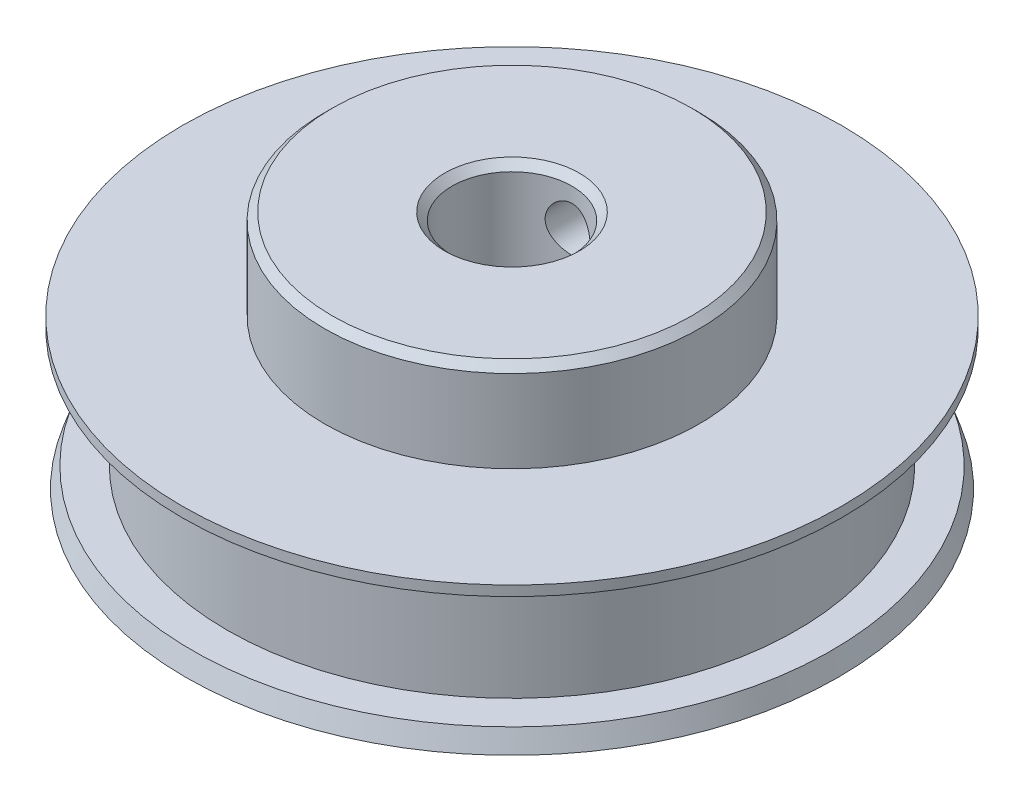
ISO-10303-21;
HEADER;
FILE_DESCRIPTION(('STEP AP214'),'2;1');
FILE_NAME('part.step','',(''),(''),'','','');
FILE_SCHEMA(('AUTOMOTIVE_DESIGN { 1 0 10303 214 1 1 1 1 }'));
ENDSEC;
DATA;
#1=APPLICATION_CONTEXT('core data for automotive mechanical design processes');
#2=APPLICATION_PROTOCOL_DEFINITION('international standard','automotive_design',2000,#1);
#3=PRODUCT_CONTEXT('',#1,'mechanical');
#4=PRODUCT('Part','Part','',(#3));
#5=PRODUCT_RELATED_PRODUCT_CATEGORY('part','',(#4));
#6=PRODUCT_DEFINITION_FORMATION('','',#4);
#7=PRODUCT_DEFINITION_CONTEXT('part definition',#1,'design');
#8=PRODUCT_DEFINITION('design','',#6,#7);
#9=PRODUCT_DEFINITION_SHAPE('','',#8);
#10=(LENGTH_UNIT() NAMED_UNIT(*) SI_UNIT(.MILLI.,.METRE.));
#11=(NAMED_UNIT(*) PLANE_ANGLE_UNIT() SI_UNIT($,.RADIAN.));
#12=(NAMED_UNIT(*) SI_UNIT($,.STERADIAN.) SOLID_ANGLE_UNIT());
#13=UNCERTAINTY_MEASURE_WITH_UNIT(LENGTH_MEASURE(1.E-05),#10,'distance_accuracy_value','');
#14=(GEOMETRIC_REPRESENTATION_CONTEXT(3) GLOBAL_UNCERTAINTY_ASSIGNED_CONTEXT((#13)) GLOBAL_UNIT_ASSIGNED_CONTEXT((#10,
#11,#12)) REPRESENTATION_CONTEXT('',''));
#15=CARTESIAN_POINT('',(0.,0.,0.));
#16=DIRECTION('',(0.,0.,1.));
#17=DIRECTION('',(1.,0.,0.));
#18=AXIS2_PLACEMENT_3D('',#15,#16,#17);
#19=CARTESIAN_POINT('',(0.,10.,0.));
#20=DIRECTION('',(0.,-1.,0.));
#21=DIRECTION('',(0.,0.,-1.));
#22=AXIS2_PLACEMENT_3D('',#19,#20,#21);
#23=CYLINDRICAL_SURFACE('',#22,22.);
#24=CARTESIAN_POINT('',(0.,9.32933000000001,0.));
#25=DIRECTION('',(0.,-1.,0.));
#26=DIRECTION('',(0.,0.,-1.));
#27=AXIS2_PLACEMENT_3D('',#24,#25,#26);
#28=CIRCLE('',#27,22.);
#29=CARTESIAN_POINT('',(0.,9.32933000000001,-22.));
#30=VERTEX_POINT('',#29);
#31=EDGE_CURVE('E71',#30,#30,#28,.F.);
#32=ORIENTED_EDGE('',*,*,#31,.T.);
#33=EDGE_LOOP('',(#32));
#34=FACE_BOUND('',#33,.T.);
#35=CARTESIAN_POINT('',(0.,10.,0.));
#36=DIRECTION('',(0.,1.,0.));
#37=DIRECTION('',(0.,0.,1.));
#38=AXIS2_PLACEMENT_3D('',#35,#36,#37);
#39=CIRCLE('',#38,22.);
#40=CARTESIAN_POINT('',(0.,10.,22.));
#41=VERTEX_POINT('',#40);
#42=EDGE_CURVE('E88',#41,#41,#39,.T.);
#43=ORIENTED_EDGE('',*,*,#42,.F.);
#44=EDGE_LOOP('',(#43));
#45=FACE_BOUND('',#44,.T.);
#46=ADVANCED_FACE('F38',(#34,#45),#23,.T.);
#47=CARTESIAN_POINT('',(0.,10.,0.));
#48=DIRECTION('',(0.,1.,0.));
#49=DIRECTION('',(0.,0.,1.));
#50=AXIS2_PLACEMENT_3D('',#47,#48,#49);
#51=PLANE('',#50);
#52=CARTESIAN_POINT('',(0.,10.,0.));
#53=DIRECTION('',(0.,1.,0.));
#54=DIRECTION('',(0.,0.,1.));
#55=AXIS2_PLACEMENT_3D('',#52,#53,#54);
#56=CIRCLE('',#55,12.5);
#57=CARTESIAN_POINT('',(0.,10.,12.5));
#58=VERTEX_POINT('',#57);
#59=EDGE_CURVE('E87',#58,#58,#56,.T.);
#60=ORIENTED_EDGE('',*,*,#59,.F.);
#61=EDGE_LOOP('',(#60));
#62=FACE_BOUND('',#61,.T.);
#63=ORIENTED_EDGE('',*,*,#42,.T.);
#64=EDGE_LOOP('',(#63));
#65=FACE_BOUND('',#64,.T.);
#66=ADVANCED_FACE('F143',(#62,#65),#51,.T.);
#67=CARTESIAN_POINT('',(0.,0.,0.));
#68=DIRECTION('',(0.,1.,0.));
#69=DIRECTION('',(0.,0.,1.));
#70=AXIS2_PLACEMENT_3D('',#67,#68,#69);
#71=PLANE('',#70);
#72=CARTESIAN_POINT('',(0.,0.,0.));
#73=DIRECTION('',(0.,1.,0.));
#74=DIRECTION('',(0.,0.,1.));
#75=AXIS2_PLACEMENT_3D('',#72,#73,#74);
#76=CIRCLE('',#75,4.50000000000001);
#77=CARTESIAN_POINT('',(0.,0.,4.50000000000001));
#78=VERTEX_POINT('',#77);
#79=EDGE_CURVE('E57',#78,#78,#76,.T.);
#80=ORIENTED_EDGE('',*,*,#79,.T.);
#81=EDGE_LOOP('',(#80));
#82=FACE_BOUND('',#81,.T.);
#83=CARTESIAN_POINT('',(0.,0.,0.));
#84=DIRECTION('',(0.,1.,0.));
#85=DIRECTION('',(0.,0.,1.));
#86=AXIS2_PLACEMENT_3D('',#83,#84,#85);
#87=CIRCLE('',#86,21.77689);
#88=CARTESIAN_POINT('',(0.,0.,21.77689));
#89=VERTEX_POINT('',#88);
#90=EDGE_CURVE('E83',#89,#89,#87,.F.);
#91=ORIENTED_EDGE('',*,*,#90,.T.);
#92=EDGE_LOOP('',(#91));
#93=FACE_BOUND('',#92,.T.);
#94=ADVANCED_FACE('F149',(#82,#93),#71,.F.);
#95=CARTESIAN_POINT('',(0.,16.,0.));
#96=DIRECTION('',(0.,-1.,0.));
#97=DIRECTION('',(0.,0.,-1.));
#98=AXIS2_PLACEMENT_3D('',#95,#96,#97);
#99=CYLINDRICAL_SURFACE('',#98,12.5);
#100=CARTESIAN_POINT('',(0.,15.5,0.));
#101=DIRECTION('',(0.,1.,0.));
#102=DIRECTION('',(0.,0.,1.));
#103=AXIS2_PLACEMENT_3D('',#100,#101,#102);
#104=CIRCLE('',#103,12.5);
#105=CARTESIAN_POINT('',(0.,15.5,12.5));
#106=VERTEX_POINT('',#105);
#107=EDGE_CURVE('E10',#106,#106,#104,.F.);
#108=ORIENTED_EDGE('',*,*,#107,.T.);
#109=EDGE_LOOP('',(#108));
#110=FACE_BOUND('',#109,.T.);
#111=CARTESIAN_POINT('',(1.5,13.,-12.4096736459909));
#112=CARTESIAN_POINT('',(1.49999641586388,12.9160704294048,-12.4096748089167));
#113=CARTESIAN_POINT('',(1.49293206748169,12.8320877399393,-12.4105342894214));
#114=CARTESIAN_POINT('',(1.46486159354819,12.6664576939842,-12.4138782255216));
#115=CARTESIAN_POINT('',(1.44384072619508,12.5848129021595,-12.4163643992983));
#116=CARTESIAN_POINT('',(1.38848417307918,12.4262807972431,-12.4226761552619));
#117=CARTESIAN_POINT('',(1.35415731394874,12.3493903694319,-12.426500849368));
#118=CARTESIAN_POINT('',(1.27318168778971,12.2024764289495,-12.4350576249844));
#119=CARTESIAN_POINT('',(1.22653510106007,12.132451704216,-12.4397895458966));
#120=CARTESIAN_POINT('',(1.1219857196502,12.0008801141949,-12.4496550027324));
#121=CARTESIAN_POINT('',(1.06403198625323,11.9393738528257,-12.4547902908254));
#122=CARTESIAN_POINT('',(0.938622932174396,11.826935640919,-12.4648680792729));
#123=CARTESIAN_POINT('',(0.87116714752707,11.7760042070291,-12.4698105701984));
#124=CARTESIAN_POINT('',(0.72841478423399,11.6860167335319,-12.4789637011531));
#125=CARTESIAN_POINT('',(0.653094976924496,11.6469972921302,-12.4831720690333));
#126=CARTESIAN_POINT('',(0.49691288363639,11.5821757698076,-12.4903635621621));
#127=CARTESIAN_POINT('',(0.416050788042772,11.5563732351261,-12.4933467294733));
#128=CARTESIAN_POINT('',(0.251493928492542,11.5188388719483,-12.4977393662263));
#129=CARTESIAN_POINT('',(0.16781473552169,11.5070396732771,-12.4991563682204));
#130=CARTESIAN_POINT('',(-0.000347248334281743,11.4976382003447,-12.5002827183051));
#131=CARTESIAN_POINT('',(-0.0848300098341689,11.5000354089209,-12.4999921286017));
#132=CARTESIAN_POINT('',(-0.251742833758764,11.5189045609257,-12.4977421462633));
#133=CARTESIAN_POINT('',(-0.334181218784105,11.5353040524862,-12.4957913442169));
#134=CARTESIAN_POINT('',(-0.495127185045587,11.581599075858,-12.490449821119));
#135=CARTESIAN_POINT('',(-0.573634696521301,11.6114948470908,-12.4870590745233));
#136=CARTESIAN_POINT('',(-0.724715561629687,11.6840113644533,-12.4792038952277));
#137=CARTESIAN_POINT('',(-0.797273648637691,11.7266636180032,-12.4747368094346));
#138=CARTESIAN_POINT('',(-0.934229460099391,11.8234594494781,-12.465229048358));
#139=CARTESIAN_POINT('',(-0.998626839383444,11.8776035132078,-12.4601883488298));
#140=CARTESIAN_POINT('',(-1.11785860561525,11.9962521747702,-12.4500603372648));
#141=CARTESIAN_POINT('',(-1.17263019439189,12.0608198906867,-12.4449729316271));
#142=CARTESIAN_POINT('',(-1.27056795912578,12.1982657568398,-12.4353563023037));
#143=CARTESIAN_POINT('',(-1.31373410365263,12.2711439295822,-12.4308270801297));
#144=CARTESIAN_POINT('',(-1.38723839179325,12.4231962450737,-12.4228396027608));
#145=CARTESIAN_POINT('',(-1.41757175578821,12.502372720629,-12.4193817467283));
#146=CARTESIAN_POINT('',(-1.46449505016189,12.6647461797506,-12.4139364153306));
#147=CARTESIAN_POINT('',(-1.48108558929275,12.7479429850596,-12.4119488748366));
#148=CARTESIAN_POINT('',(-1.49996964356083,12.9154415481883,-12.4096810007818));
#149=CARTESIAN_POINT('',(-1.50235142135386,12.9997332179406,-12.4093901280317));
#150=CARTESIAN_POINT('',(-1.49298299027801,13.1675143904215,-12.4105206650573));
#151=CARTESIAN_POINT('',(-1.48123305845624,13.2510039088437,-12.411942041265));
#152=CARTESIAN_POINT('',(-1.44400895971009,13.414547891799,-12.4163273137489));
#153=CARTESIAN_POINT('',(-1.41857731249469,13.4946121734047,-12.4192864301079));
#154=CARTESIAN_POINT('',(-1.35475538396312,13.649339641488,-12.4264098926624));
#155=CARTESIAN_POINT('',(-1.31636468129306,13.7240026522515,-12.4305742780457));
#156=CARTESIAN_POINT('',(-1.22749651360805,13.8662081474873,-12.4396643656649));
#157=CARTESIAN_POINT('',(-1.17696103570738,13.9337141434407,-12.4445936804928));
#158=CARTESIAN_POINT('',(-1.06532008918354,14.0593175565059,-12.4546467770184));
#159=CARTESIAN_POINT('',(-1.0042142422181,14.1174146367029,-12.4597705656719));
#160=CARTESIAN_POINT('',(-0.872782136333861,14.2228598736175,-12.4696675472455));
#161=CARTESIAN_POINT('',(-0.802409249708916,14.2701501232557,-12.4744387628015));
#162=CARTESIAN_POINT('',(-0.654668214705289,14.3522391046645,-12.483063621558));
#163=CARTESIAN_POINT('',(-0.577300197822208,14.3870380711872,-12.4869172820019));
#164=CARTESIAN_POINT('',(-0.417959622359993,14.4430605024379,-12.4932640215257));
#165=CARTESIAN_POINT('',(-0.335999085323591,14.4643177599421,-12.4957604851314));
#166=CARTESIAN_POINT('',(-0.16964029249574,14.4927633717911,-12.4991255682254));
#167=CARTESIAN_POINT('',(-0.0852421377306314,14.4999523083466,-12.4999942550783));
#168=CARTESIAN_POINT('',(0.0830300031278284,14.5000469220562,-12.5000056524324));
#169=CARTESIAN_POINT('',(0.166903952329434,14.4930420183416,-12.4991591682624));
#170=CARTESIAN_POINT('',(0.332273612398116,14.4651367725488,-12.4958567701035));
#171=CARTESIAN_POINT('',(0.413769324044742,14.4442364350252,-12.4934008566421));
#172=CARTESIAN_POINT('',(0.572059777991806,14.3891609924342,-12.4871544009745));
#173=CARTESIAN_POINT('',(0.648855904373997,14.3549898177728,-12.4833642539575));
#174=CARTESIAN_POINT('',(0.795637705262653,14.2743519652078,-12.474869622158));
#175=CARTESIAN_POINT('',(0.865623324646849,14.2278851877986,-12.4701651299761));
#176=CARTESIAN_POINT('',(0.997254742124291,14.1236431589969,-12.4603319681132));
#177=CARTESIAN_POINT('',(1.0588476339384,14.0658013223371,-12.4552009088046));
#178=CARTESIAN_POINT('',(1.17148865356204,13.9405884814238,-12.4451123432295));
#179=CARTESIAN_POINT('',(1.22253427406543,13.8732152177493,-12.4401548784622));
#180=CARTESIAN_POINT('',(1.31278537364373,13.7305785319148,-12.4309559603764));
#181=CARTESIAN_POINT('',(1.35194799100155,13.6552878358635,-12.4267171228205));
#182=CARTESIAN_POINT('',(1.41701902911872,13.4991911231246,-12.419466118837));
#183=CARTESIAN_POINT('',(1.44294198213015,13.4183912644011,-12.4164526081981));
#184=CARTESIAN_POINT('',(1.4745350503682,13.2809702304473,-12.4127313618494));
#185=CARTESIAN_POINT('',(1.48407082470974,13.2252186240201,-12.4115903654975));
#186=CARTESIAN_POINT('',(1.49680448454755,13.1129860339329,-12.4100611186528));
#187=CARTESIAN_POINT('',(1.50000241299709,13.0565050552187,-12.4096728630583));
#188=CARTESIAN_POINT('',(1.5,13.,-12.4096736459909));
#189=B_SPLINE_CURVE_WITH_KNOTS('',3,(#111,#112,#113,#114,#115,#116,#117,#118,#119,#120,#121,
#122,#123,#124,#125,#126,#127,#128,#129,#130,#131,#132,#133,#134,#135,#136,#137,#138,#139,#140,
#141,#142,#143,#144,#145,#146,#147,#148,#149,#150,#151,#152,#153,#154,#155,#156,#157,#158,#159,
#160,#161,#162,#163,#164,#165,#166,#167,#168,#169,#170,#171,#172,#173,#174,#175,#176,#177,#178,
#179,#180,#181,#182,#183,#184,#185,#186,#187,#188),.UNSPECIFIED.,.T.,.F.,(4,2,2,2,2,2,2,2,2,2,2,
2,2,2,2,2,2,2,2,2,2,2,2,2,2,2,2,2,2,2,2,2,2,2,2,2,2,2,4),(0.,0.25158230660961,0.503430774819311,
0.755112462522261,1.0067496383611,1.25954776660377,1.5123582427361,1.76593780876769,
2.01950866836447,2.27185458608052,2.52419131111312,2.77523023079344,3.02627360403335,
3.27794222677635,3.52962149067918,3.78288622204422,4.03615163930559,4.28951130338294,
4.54285974404081,4.79463277043148,5.0464008609825,5.29739099483104,5.54838929022027,
5.80061125155308,6.05284224246467,6.30639464647639,6.55994228515918,6.81285470170487,
7.06575665136928,7.31707030939075,7.56838388503437,7.81962308616497,8.07086432058376,
8.32362252061905,8.57644073759112,8.83016031080822,9.08360079205962,9.25297814464871,
9.42235434931908),.UNSPECIFIED.);
#190=CARTESIAN_POINT('',(1.5,13.,-12.4096736459909));
#191=VERTEX_POINT('',#190);
#192=EDGE_CURVE('E92',#191,#191,#189,.T.);
#193=ORIENTED_EDGE('',*,*,#192,.F.);
#194=EDGE_LOOP('',(#193));
#195=FACE_BOUND('',#194,.T.);
#196=ORIENTED_EDGE('',*,*,#59,.T.);
#197=EDGE_LOOP('',(#196));
#198=FACE_BOUND('',#197,.T.);
#199=ADVANCED_FACE('F203',(#110,#195,#198),#99,.T.);
#200=CARTESIAN_POINT('',(0.,16.,0.));
#201=DIRECTION('',(0.,1.,0.));
#202=DIRECTION('',(0.,0.,1.));
#203=AXIS2_PLACEMENT_3D('',#200,#201,#202);
#204=PLANE('',#203);
#205=CARTESIAN_POINT('',(0.,16.,0.));
#206=DIRECTION('',(0.,1.,0.));
#207=DIRECTION('',(0.,0.,1.));
#208=AXIS2_PLACEMENT_3D('',#205,#206,#207);
#209=CIRCLE('',#208,4.49999999999999);
#210=CARTESIAN_POINT('',(0.,16.,4.49999999999999));
#211=VERTEX_POINT('',#210);
#212=EDGE_CURVE('E47',#211,#211,#209,.F.);
#213=ORIENTED_EDGE('',*,*,#212,.T.);
#214=EDGE_LOOP('',(#213));
#215=FACE_BOUND('',#214,.T.);
#216=CARTESIAN_POINT('',(0.,16.,0.));
#217=DIRECTION('',(0.,1.,0.));
#218=DIRECTION('',(0.,0.,1.));
#219=AXIS2_PLACEMENT_3D('',#216,#217,#218);
#220=CIRCLE('',#219,12.);
#221=CARTESIAN_POINT('',(0.,16.,12.));
#222=VERTEX_POINT('',#221);
#223=EDGE_CURVE('E52',#222,#222,#220,.T.);
#224=ORIENTED_EDGE('',*,*,#223,.T.);
#225=EDGE_LOOP('',(#224));
#226=FACE_BOUND('',#225,.T.);
#227=ADVANCED_FACE('F200',(#215,#226),#204,.T.);
#228=CARTESIAN_POINT('',(0.,13.,-22.001));
#229=DIRECTION('',(0.,0.,1.));
#230=DIRECTION('',(1.,0.,0.));
#231=AXIS2_PLACEMENT_3D('',#228,#229,#230);
#232=CYLINDRICAL_SURFACE('',#231,1.5);
#233=CARTESIAN_POINT('',(1.5,13.,-3.70809924354783));
#234=CARTESIAN_POINT('',(1.50000304106109,12.9189925162792,-3.70809640633806));
#235=CARTESIAN_POINT('',(1.49341597549487,12.8380050774964,-3.71078260240986));
#236=CARTESIAN_POINT('',(1.46736187895468,12.6784719170868,-3.72116159304967));
#237=CARTESIAN_POINT('',(1.44789523373263,12.599926122405,-3.72885423767112));
#238=CARTESIAN_POINT('',(1.39689657610574,12.4476246283865,-3.748254802809));
#239=CARTESIAN_POINT('',(1.36539347266348,12.3738579433489,-3.7599530956926));
#240=CARTESIAN_POINT('',(1.29131856742698,12.2326281031812,-3.78603134206598));
#241=CARTESIAN_POINT('',(1.24874344095039,12.1651668497175,-3.80041210067323));
#242=CARTESIAN_POINT('',(1.15146661374162,12.0351096883772,-3.83103574665713));
#243=CARTESIAN_POINT('',(1.09630381213306,11.9728714703706,-3.84733341923603));
#244=CARTESIAN_POINT('',(0.976395839778926,11.8582771853285,-3.87949750628547));
#245=CARTESIAN_POINT('',(0.911648630256679,11.8059232262581,-3.89536382814785));
#246=CARTESIAN_POINT('',(0.7716946551776,11.7108604877044,-3.92552873936553));
#247=CARTESIAN_POINT('',(0.696206947538027,11.6685405252841,-3.93975561223505));
#248=CARTESIAN_POINT('',(0.538555771965247,11.5973488274751,-3.96438007973848));
#249=CARTESIAN_POINT('',(0.456394630933536,11.568472428008,-3.97477900217006));
#250=CARTESIAN_POINT('',(0.291489341676832,11.5262421042254,-3.9901869710344));
#251=CARTESIAN_POINT('',(0.208923197281597,11.5122723725595,-3.99540915214774));
#252=CARTESIAN_POINT('',(0.0424643637947866,11.498278799055,-4.0006401410794));
#253=CARTESIAN_POINT('',(-0.0414278850628324,11.4982504223813,-4.00065064414902));
#254=CARTESIAN_POINT('',(-0.203743543064475,11.5117817614652,-3.99559265903894));
#255=CARTESIAN_POINT('',(-0.2822321782669,11.5246692979488,-3.99077541996683));
#256=CARTESIAN_POINT('',(-0.435839217984391,11.5625359152256,-3.97693274932263));
#257=CARTESIAN_POINT('',(-0.510957383430298,11.587515852262,-3.96790701975578));
#258=CARTESIAN_POINT('',(-0.656989017303103,11.6491704516758,-3.94637769167531));
#259=CARTESIAN_POINT('',(-0.727825392287308,11.6860100052684,-3.93382539470077));
#260=CARTESIAN_POINT('',(-0.862486607957558,11.7701920969294,-3.90651310225279));
#261=CARTESIAN_POINT('',(-0.926309176932322,11.8175380230176,-3.8917523951284));
#262=CARTESIAN_POINT('',(-1.04909048680094,11.9246272862832,-3.86052529655816));
#263=CARTESIAN_POINT('',(-1.10754614526348,11.9849339156504,-3.84400963763883));
#264=CARTESIAN_POINT('',(-1.21370395569342,12.1145929933216,-3.81182460645722));
#265=CARTESIAN_POINT('',(-1.261403406929,12.1839477065866,-3.79615544748847));
#266=CARTESIAN_POINT('',(-1.34565611808152,12.3317194674628,-3.76712703500335));
#267=CARTESIAN_POINT('',(-1.38193847851831,12.4103034936861,-3.75382677150277));
#268=CARTESIAN_POINT('',(-1.44056464441501,12.5730962251676,-3.73172438629002));
#269=CARTESIAN_POINT('',(-1.46291620605595,12.6573017715937,-3.72291976205783));
#270=CARTESIAN_POINT('',(-1.49190191709668,12.823975962316,-3.71139597222848));
#271=CARTESIAN_POINT('',(-1.49933521158966,12.9062841055361,-3.70836785241537));
#272=CARTESIAN_POINT('',(-1.50057885636272,13.0710093567417,-3.70786539525016));
#273=CARTESIAN_POINT('',(-1.49439261093762,13.1534264323525,-3.71038967003987));
#274=CARTESIAN_POINT('',(-1.46929733520157,13.3119299222877,-3.72039381629735));
#275=CARTESIAN_POINT('',(-1.45100618334225,13.3881311357647,-3.72763276216449));
#276=CARTESIAN_POINT('',(-1.40299774640638,13.5363479447202,-3.74596487046362));
#277=CARTESIAN_POINT('',(-1.37327812034623,13.6083626791681,-3.75705882250173));
#278=CARTESIAN_POINT('',(-1.30200292275278,13.7491644380762,-3.7823624311608));
#279=CARTESIAN_POINT('',(-1.26004545177047,13.8177292921373,-3.79667328892065));
#280=CARTESIAN_POINT('',(-1.16591317862479,13.947128981726,-3.82662814294291));
#281=CARTESIAN_POINT('',(-1.11373463696435,14.0079609746246,-3.84227262594077));
#282=CARTESIAN_POINT('',(-0.996727340900938,14.1241683731951,-3.87433046553184));
#283=CARTESIAN_POINT('',(-0.931306341491062,14.1789534087688,-3.89072969357028));
#284=CARTESIAN_POINT('',(-0.791797471753151,14.2768383675894,-3.92149874963302));
#285=CARTESIAN_POINT('',(-0.717709573322674,14.3199382529458,-3.93586857107664));
#286=CARTESIAN_POINT('',(-0.563016329468478,14.3929460561996,-3.96094985704552));
#287=CARTESIAN_POINT('',(-0.482434433064628,14.4228991237926,-3.9716738133801));
#288=CARTESIAN_POINT('',(-0.316881887523256,14.4686564138499,-3.98829436712571));
#289=CARTESIAN_POINT('',(-0.231913320723594,14.4844672854224,-3.99419323299412));
#290=CARTESIAN_POINT('',(-0.0653355852738171,14.5007744027548,-4.00028407317073));
#291=CARTESIAN_POINT('',(0.0161807680608437,14.502109483059,-4.00078860953764));
#292=CARTESIAN_POINT('',(0.178226786412422,14.4915848405546,-3.99684889809224));
#293=CARTESIAN_POINT('',(0.258756569245255,14.4797267091141,-3.9924052471313));
#294=CARTESIAN_POINT('',(0.414548248377124,14.4437411485064,-3.97921089603771));
#295=CARTESIAN_POINT('',(0.489890731068833,14.4199200941216,-3.97056791378017));
#296=CARTESIAN_POINT('',(0.635515473006388,14.3609899866156,-3.9498778362099));
#297=CARTESIAN_POINT('',(0.705796771275541,14.3258787966952,-3.93783009655664));
#298=CARTESIAN_POINT('',(0.842540176994411,14.2436860564952,-3.91090618300074));
#299=CARTESIAN_POINT('',(0.908717548846847,14.1961633594859,-3.89593240108829));
#300=CARTESIAN_POINT('',(1.03241734752336,14.0911921698124,-3.86499507694844));
#301=CARTESIAN_POINT('',(1.0899366712559,14.0337401341921,-3.84903118274027));
#302=CARTESIAN_POINT('',(1.19781214236196,13.9069358683549,-3.81688129739175));
#303=CARTESIAN_POINT('',(1.24762999816025,13.8371155978457,-3.8007280534916));
#304=CARTESIAN_POINT('',(1.33484709556843,13.6895841304267,-3.77098325003638));
#305=CARTESIAN_POINT('',(1.37224504878157,13.6118721159465,-3.75739195631216));
#306=CARTESIAN_POINT('',(1.4346588697426,13.4470443190246,-3.73402269853266));
#307=CARTESIAN_POINT('',(1.45906002899523,13.3596656334882,-3.7244380329086));
#308=CARTESIAN_POINT('',(1.49172356722079,13.1815147280442,-3.71147994336315));
#309=CARTESIAN_POINT('',(1.49999659339571,13.09074478729,-3.70810242179736));
#310=CARTESIAN_POINT('',(1.5,13.,-3.70809924354783));
#311=B_SPLINE_CURVE_WITH_KNOTS('',3,(#233,#234,#235,#236,#237,#238,#239,#240,#241,#242,#243,
#244,#245,#246,#247,#248,#249,#250,#251,#252,#253,#254,#255,#256,#257,#258,#259,#260,#261,#262,
#263,#264,#265,#266,#267,#268,#269,#270,#271,#272,#273,#274,#275,#276,#277,#278,#279,#280,#281,
#282,#283,#284,#285,#286,#287,#288,#289,#290,#291,#292,#293,#294,#295,#296,#297,#298,#299,#300,
#301,#302,#303,#304,#305,#306,#307,#308,#309,#310),.UNSPECIFIED.,.T.,.F.,(4,2,2,2,2,2,2,2,2,2,2,
2,2,2,2,2,2,2,2,2,2,2,2,2,2,2,2,2,2,2,2,2,2,2,2,2,2,2,4),(0.,0.242684541416169,
0.485361814598854,0.727459856757029,0.969630679682932,1.22274652401128,1.47591628822983,
1.73770072136421,1.9993942638133,2.24980018489679,2.50012465404857,2.73806472803194,
2.97602165263335,3.21744131210668,3.45893893628976,3.71456675065874,3.97025867827334,
4.23162592252966,4.49284751635474,4.73965657740485,4.98640395388884,5.22143845928198,
5.45652113429526,5.70041561005821,5.94439948466355,6.20385016993624,6.46330169650177,
6.72185508890168,6.98028685560126,7.22365720549935,7.46699820319479,7.7044027400389,
7.94185223512831,8.18928323676986,8.43680270894964,8.69738599542079,8.95799630544242,
9.23003178870926,9.50188762323053),.UNSPECIFIED.);
#312=CARTESIAN_POINT('',(1.5,13.,-3.70809924354783));
#313=VERTEX_POINT('',#312);
#314=EDGE_CURVE('E104',#313,#313,#311,.T.);
#315=ORIENTED_EDGE('',*,*,#314,.F.);
#316=EDGE_LOOP('',(#315));
#317=FACE_BOUND('',#316,.T.);
#318=ORIENTED_EDGE('',*,*,#192,.T.);
#319=EDGE_LOOP('',(#318));
#320=FACE_BOUND('',#319,.T.);
#321=ADVANCED_FACE('F111',(#317,#320),#232,.F.);
#322=CARTESIAN_POINT('',(0.,-0.001000000000001,0.));
#323=DIRECTION('',(0.,1.,0.));
#324=DIRECTION('',(0.,0.,1.));
#325=AXIS2_PLACEMENT_3D('',#322,#323,#324);
#326=CYLINDRICAL_SURFACE('',#325,4.);
#327=CARTESIAN_POINT('',(0.,0.500000000000014,0.));
#328=DIRECTION('',(0.,1.,0.));
#329=DIRECTION('',(0.,0.,1.));
#330=AXIS2_PLACEMENT_3D('',#327,#328,#329);
#331=CIRCLE('',#330,4.);
#332=CARTESIAN_POINT('',(0.,0.500000000000014,4.));
#333=VERTEX_POINT('',#332);
#334=EDGE_CURVE('E63',#333,#333,#331,.F.);
#335=ORIENTED_EDGE('',*,*,#334,.T.);
#336=EDGE_LOOP('',(#335));
#337=FACE_BOUND('',#336,.T.);
#338=CARTESIAN_POINT('',(0.,15.5,0.));
#339=DIRECTION('',(0.,1.,0.));
#340=DIRECTION('',(0.,0.,1.));
#341=AXIS2_PLACEMENT_3D('',#338,#339,#340);
#342=CIRCLE('',#341,4.);
#343=CARTESIAN_POINT('',(0.,15.5,4.));
#344=VERTEX_POINT('',#343);
#345=EDGE_CURVE('E67',#344,#344,#342,.T.);
#346=ORIENTED_EDGE('',*,*,#345,.T.);
#347=EDGE_LOOP('',(#346));
#348=FACE_BOUND('',#347,.T.);
#349=ORIENTED_EDGE('',*,*,#314,.T.);
#350=EDGE_LOOP('',(#349));
#351=FACE_BOUND('',#350,.T.);
#352=ADVANCED_FACE('F115',(#337,#348,#351),#326,.F.);
#353=CARTESIAN_POINT('',(0.,8.66333,0.));
#354=DIRECTION('',(0.,-1.,0.));
#355=DIRECTION('',(0.,0.,-1.));
#356=AXIS2_PLACEMENT_3D('',#353,#354,#355);
#357=PLANE('',#356);
#358=CARTESIAN_POINT('',(0.,8.66333,0.));
#359=DIRECTION('',(0.,-1.,0.));
#360=DIRECTION('',(0.,0.,-1.));
#361=AXIS2_PLACEMENT_3D('',#358,#359,#360);
#362=CIRCLE('',#361,20.);
#363=CARTESIAN_POINT('',(0.,8.66333,-20.));
#364=VERTEX_POINT('',#363);
#365=EDGE_CURVE('E75',#364,#364,#362,.T.);
#366=ORIENTED_EDGE('',*,*,#365,.T.);
#367=EDGE_LOOP('',(#366));
#368=FACE_BOUND('',#367,.T.);
#369=CARTESIAN_POINT('',(0.,8.66333,0.));
#370=DIRECTION('',(0.,-1.,0.));
#371=DIRECTION('',(0.,0.,-1.));
#372=AXIS2_PLACEMENT_3D('',#369,#370,#371);
#373=CIRCLE('',#372,19.);
#374=CARTESIAN_POINT('',(0.,8.66333,-19.));
#375=VERTEX_POINT('',#374);
#376=EDGE_CURVE('E188',#375,#375,#373,.T.);
#377=ORIENTED_EDGE('',*,*,#376,.F.);
#378=EDGE_LOOP('',(#377));
#379=FACE_BOUND('',#378,.T.);
#380=ADVANCED_FACE('F118',(#368,#379),#357,.T.);
#381=CARTESIAN_POINT('',(0.,1.33,0.));
#382=DIRECTION('',(0.,-1.,0.));
#383=DIRECTION('',(0.,0.,-1.));
#384=AXIS2_PLACEMENT_3D('',#381,#382,#383);
#385=PLANE('',#384);
#386=CARTESIAN_POINT('',(0.,1.33,0.));
#387=DIRECTION('',(0.,-1.,0.));
#388=DIRECTION('',(0.,0.,-1.));
#389=AXIS2_PLACEMENT_3D('',#386,#387,#388);
#390=CIRCLE('',#389,21.334);
#391=CARTESIAN_POINT('',(0.,1.33,-21.334));
#392=VERTEX_POINT('',#391);
#393=EDGE_CURVE('E79',#392,#392,#390,.F.);
#394=ORIENTED_EDGE('',*,*,#393,.T.);
#395=EDGE_LOOP('',(#394));
#396=FACE_BOUND('',#395,.T.);
#397=CARTESIAN_POINT('',(0.,1.33,0.));
#398=DIRECTION('',(0.,-1.,0.));
#399=DIRECTION('',(0.,0.,-1.));
#400=AXIS2_PLACEMENT_3D('',#397,#398,#399);
#401=CIRCLE('',#400,19.);
#402=CARTESIAN_POINT('',(0.,1.33,-19.));
#403=VERTEX_POINT('',#402);
#404=EDGE_CURVE('E190',#403,#403,#401,.T.);
#405=ORIENTED_EDGE('',*,*,#404,.T.);
#406=EDGE_LOOP('',(#405));
#407=FACE_BOUND('',#406,.T.);
#408=ADVANCED_FACE('F122',(#396,#407),#385,.F.);
#409=CARTESIAN_POINT('',(0.,8.66333,0.));
#410=DIRECTION('',(0.,-1.,0.));
#411=DIRECTION('',(0.,0.,-1.));
#412=AXIS2_PLACEMENT_3D('',#409,#410,#411);
#413=CYLINDRICAL_SURFACE('',#412,19.);
#414=ORIENTED_EDGE('',*,*,#376,.T.);
#415=EDGE_LOOP('',(#414));
#416=FACE_BOUND('',#415,.T.);
#417=ORIENTED_EDGE('',*,*,#404,.F.);
#418=EDGE_LOOP('',(#417));
#419=FACE_BOUND('',#418,.T.);
#420=ADVANCED_FACE('F125',(#416,#419),#413,.T.);
#421=CARTESIAN_POINT('',(0.,-0.670000000000006,0.));
#422=DIRECTION('',(0.,-1.,0.));
#423=DIRECTION('',(0.,0.,-1.));
#424=AXIS2_PLACEMENT_3D('',#421,#422,#423);
#425=CONICAL_SURFACE('',#424,22.,0.32145052440265);
#426=ORIENTED_EDGE('',*,*,#393,.F.);
#427=EDGE_LOOP('',(#426));
#428=FACE_BOUND('',#427,.T.);
#429=ORIENTED_EDGE('',*,*,#90,.F.);
#430=EDGE_LOOP('',(#429));
#431=FACE_BOUND('',#430,.T.);
#432=ADVANCED_FACE('F131',(#428,#431),#425,.T.);
#433=CARTESIAN_POINT('',(0.,8.66333,0.));
#434=DIRECTION('',(0.,1.,0.));
#435=DIRECTION('',(0.,0.,1.));
#436=AXIS2_PLACEMENT_3D('',#433,#434,#435);
#437=CONICAL_SURFACE('',#436,20.,1.24934580239226);
#438=ORIENTED_EDGE('',*,*,#31,.F.);
#439=EDGE_LOOP('',(#438));
#440=FACE_BOUND('',#439,.T.);
#441=ORIENTED_EDGE('',*,*,#365,.F.);
#442=EDGE_LOOP('',(#441));
#443=FACE_BOUND('',#442,.T.);
#444=ADVANCED_FACE('F137',(#440,#443),#437,.T.);
#445=CARTESIAN_POINT('',(0.,0.500000000000014,0.));
#446=DIRECTION('',(0.,-1.,0.));
#447=DIRECTION('',(0.,0.,-1.));
#448=AXIS2_PLACEMENT_3D('',#445,#446,#447);
#449=CONICAL_SURFACE('',#448,4.,0.785398163397445);
#450=ORIENTED_EDGE('',*,*,#79,.F.);
#451=EDGE_LOOP('',(#450));
#452=FACE_BOUND('',#451,.T.);
#453=ORIENTED_EDGE('',*,*,#334,.F.);
#454=EDGE_LOOP('',(#453));
#455=FACE_BOUND('',#454,.T.);
#456=ADVANCED_FACE('F164',(#452,#455),#449,.F.);
#457=CARTESIAN_POINT('',(0.,15.5,0.));
#458=DIRECTION('',(0.,1.,0.));
#459=DIRECTION('',(0.,0.,1.));
#460=AXIS2_PLACEMENT_3D('',#457,#458,#459);
#461=CONICAL_SURFACE('',#460,4.,0.785398163397448);
#462=ORIENTED_EDGE('',*,*,#212,.F.);
#463=EDGE_LOOP('',(#462));
#464=FACE_BOUND('',#463,.T.);
#465=ORIENTED_EDGE('',*,*,#345,.F.);
#466=EDGE_LOOP('',(#465));
#467=FACE_BOUND('',#466,.T.);
#468=ADVANCED_FACE('F170',(#464,#467),#461,.F.);
#469=CARTESIAN_POINT('',(0.,16.,0.));
#470=DIRECTION('',(0.,-1.,0.));
#471=DIRECTION('',(0.,0.,-1.));
#472=AXIS2_PLACEMENT_3D('',#469,#470,#471);
#473=CONICAL_SURFACE('',#472,12.,0.78539816339745);
#474=ORIENTED_EDGE('',*,*,#107,.F.);
#475=EDGE_LOOP('',(#474));
#476=FACE_BOUND('',#475,.T.);
#477=ORIENTED_EDGE('',*,*,#223,.F.);
#478=EDGE_LOOP('',(#477));
#479=FACE_BOUND('',#478,.T.);
#480=ADVANCED_FACE('F41',(#476,#479),#473,.T.);
#481=CLOSED_SHELL('',(#46,#66,#94,#199,#227,#321,#352,#380,#408,#420,#432,#444,#456,#468,#480));
#482=MANIFOLD_SOLID_BREP('B2',#481);
#483=ADVANCED_BREP_SHAPE_REPRESENTATION('',(#18,#482),#14);
#484=SHAPE_DEFINITION_REPRESENTATION(#9,#483);
ENDSEC;
END-ISO-10303-21;
